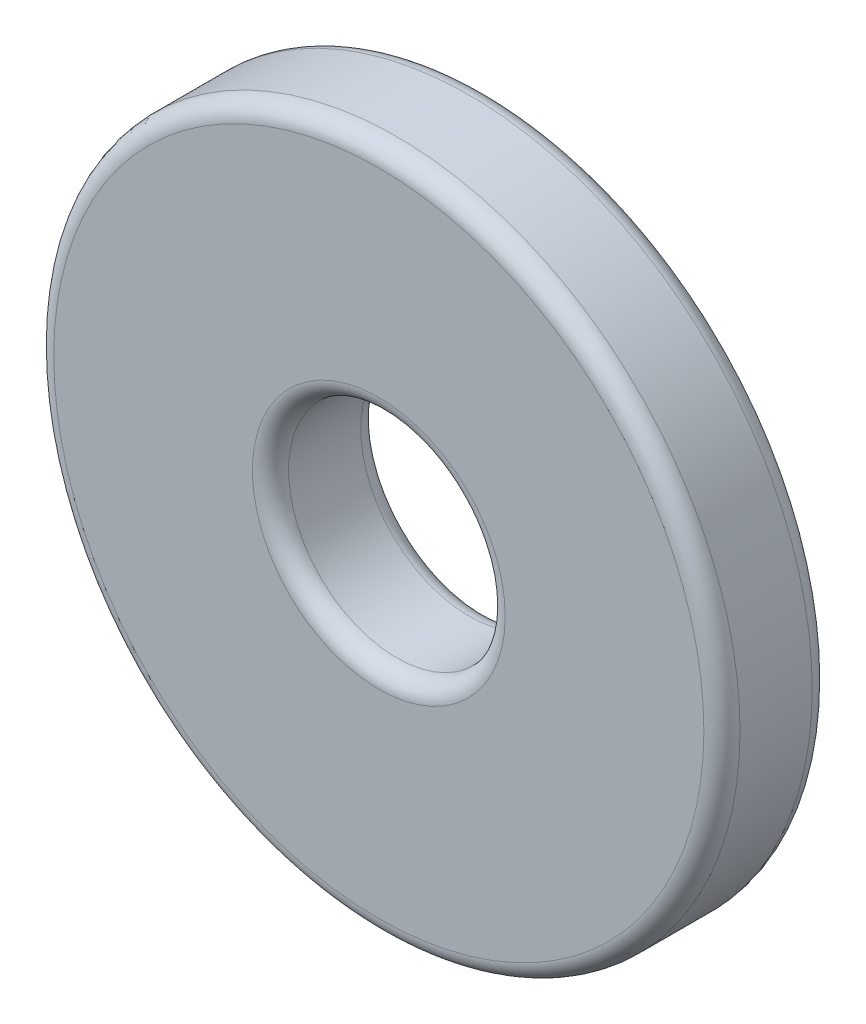
ISO-10303-21;
HEADER;
FILE_DESCRIPTION(('STEP AP214'),'2;1');
FILE_NAME('part.step','',(''),(''),'','','');
FILE_SCHEMA(('AUTOMOTIVE_DESIGN { 1 0 10303 214 1 1 1 1 }'));
ENDSEC;
DATA;
#1=APPLICATION_CONTEXT('core data for automotive mechanical design processes');
#2=APPLICATION_PROTOCOL_DEFINITION('international standard','automotive_design',2000,#1);
#3=PRODUCT_CONTEXT('',#1,'mechanical');
#4=PRODUCT('Part','Part','',(#3));
#5=PRODUCT_RELATED_PRODUCT_CATEGORY('part','',(#4));
#6=PRODUCT_DEFINITION_FORMATION('','',#4);
#7=PRODUCT_DEFINITION_CONTEXT('part definition',#1,'design');
#8=PRODUCT_DEFINITION('design','',#6,#7);
#9=PRODUCT_DEFINITION_SHAPE('','',#8);
#10=(LENGTH_UNIT() NAMED_UNIT(*) SI_UNIT(.MILLI.,.METRE.));
#11=(NAMED_UNIT(*) PLANE_ANGLE_UNIT() SI_UNIT($,.RADIAN.));
#12=(NAMED_UNIT(*) SI_UNIT($,.STERADIAN.) SOLID_ANGLE_UNIT());
#13=UNCERTAINTY_MEASURE_WITH_UNIT(LENGTH_MEASURE(1.E-05),#10,'distance_accuracy_value','');
#14=(GEOMETRIC_REPRESENTATION_CONTEXT(3) GLOBAL_UNCERTAINTY_ASSIGNED_CONTEXT((#13)) GLOBAL_UNIT_ASSIGNED_CONTEXT((#10,
#11,#12)) REPRESENTATION_CONTEXT('',''));
#15=CARTESIAN_POINT('',(0.,0.,0.));
#16=DIRECTION('',(0.,0.,1.));
#17=DIRECTION('',(1.,0.,0.));
#18=AXIS2_PLACEMENT_3D('',#15,#16,#17);
#19=CARTESIAN_POINT('',(0.,0.,-1.));
#20=DIRECTION('',(0.,0.,1.));
#21=DIRECTION('',(1.,0.,0.));
#22=AXIS2_PLACEMENT_3D('',#19,#20,#21);
#23=TOROIDAL_SURFACE('',#22,9.,0.5);
#24=CARTESIAN_POINT('',(0.,0.,-1.5));
#25=DIRECTION('',(0.,0.,1.));
#26=DIRECTION('',(1.,0.,0.));
#27=AXIS2_PLACEMENT_3D('',#24,#25,#26);
#28=CIRCLE('',#27,9.);
#29=CARTESIAN_POINT('',(9.,0.,-1.5));
#30=VERTEX_POINT('',#29);
#31=EDGE_CURVE('E54',#30,#30,#28,.F.);
#32=ORIENTED_EDGE('',*,*,#31,.F.);
#33=EDGE_LOOP('',(#32));
#34=FACE_BOUND('',#33,.T.);
#35=CARTESIAN_POINT('',(0.,0.,-1.));
#36=DIRECTION('',(0.,0.,1.));
#37=DIRECTION('',(1.,0.,0.));
#38=AXIS2_PLACEMENT_3D('',#35,#36,#37);
#39=CIRCLE('',#38,9.5);
#40=CARTESIAN_POINT('',(9.5,0.,-1.));
#41=VERTEX_POINT('',#40);
#42=EDGE_CURVE('E51',#41,#41,#39,.T.);
#43=ORIENTED_EDGE('',*,*,#42,.F.);
#44=EDGE_LOOP('',(#43));
#45=FACE_BOUND('',#44,.T.);
#46=ADVANCED_FACE('F31',(#34,#45),#23,.T.);
#47=CARTESIAN_POINT('',(0.,0.,1.));
#48=DIRECTION('',(0.,0.,1.));
#49=DIRECTION('',(1.,0.,0.));
#50=AXIS2_PLACEMENT_3D('',#47,#48,#49);
#51=TOROIDAL_SURFACE('',#50,9.,0.5);
#52=CARTESIAN_POINT('',(0.,0.,1.5));
#53=DIRECTION('',(0.,0.,1.));
#54=DIRECTION('',(1.,0.,0.));
#55=AXIS2_PLACEMENT_3D('',#52,#53,#54);
#56=CIRCLE('',#55,9.);
#57=CARTESIAN_POINT('',(9.,0.,1.5));
#58=VERTEX_POINT('',#57);
#59=EDGE_CURVE('E60',#58,#58,#56,.T.);
#60=ORIENTED_EDGE('',*,*,#59,.F.);
#61=EDGE_LOOP('',(#60));
#62=FACE_BOUND('',#61,.T.);
#63=CARTESIAN_POINT('',(0.,0.,1.));
#64=DIRECTION('',(0.,0.,1.));
#65=DIRECTION('',(1.,0.,0.));
#66=AXIS2_PLACEMENT_3D('',#63,#64,#65);
#67=CIRCLE('',#66,9.5);
#68=CARTESIAN_POINT('',(9.5,0.,1.));
#69=VERTEX_POINT('',#68);
#70=EDGE_CURVE('E57',#69,#69,#67,.F.);
#71=ORIENTED_EDGE('',*,*,#70,.F.);
#72=EDGE_LOOP('',(#71));
#73=FACE_BOUND('',#72,.T.);
#74=ADVANCED_FACE('F66',(#62,#73),#51,.T.);
#75=CARTESIAN_POINT('',(0.,0.,1.5));
#76=DIRECTION('',(0.,0.,1.));
#77=DIRECTION('',(1.,0.,0.));
#78=AXIS2_PLACEMENT_3D('',#75,#76,#77);
#79=PLANE('',#78);
#80=CARTESIAN_POINT('',(0.,0.,1.5));
#81=DIRECTION('',(0.,0.,1.));
#82=DIRECTION('',(1.,0.,0.));
#83=AXIS2_PLACEMENT_3D('',#80,#81,#82);
#84=CIRCLE('',#83,3.5);
#85=CARTESIAN_POINT('',(3.5,0.,1.5));
#86=VERTEX_POINT('',#85);
#87=EDGE_CURVE('E10',#86,#86,#84,.F.);
#88=ORIENTED_EDGE('',*,*,#87,.T.);
#89=EDGE_LOOP('',(#88));
#90=FACE_BOUND('',#89,.T.);
#91=ORIENTED_EDGE('',*,*,#59,.T.);
#92=EDGE_LOOP('',(#91));
#93=FACE_BOUND('',#92,.T.);
#94=ADVANCED_FACE('F64',(#90,#93),#79,.T.);
#95=CARTESIAN_POINT('',(0.,0.,-1.5));
#96=DIRECTION('',(0.,0.,1.));
#97=DIRECTION('',(1.,0.,0.));
#98=AXIS2_PLACEMENT_3D('',#95,#96,#97);
#99=PLANE('',#98);
#100=CARTESIAN_POINT('',(0.,0.,-1.5));
#101=DIRECTION('',(0.,0.,1.));
#102=DIRECTION('',(1.,0.,0.));
#103=AXIS2_PLACEMENT_3D('',#100,#101,#102);
#104=CIRCLE('',#103,3.5);
#105=CARTESIAN_POINT('',(3.5,0.,-1.5));
#106=VERTEX_POINT('',#105);
#107=EDGE_CURVE('E46',#106,#106,#104,.T.);
#108=ORIENTED_EDGE('',*,*,#107,.T.);
#109=EDGE_LOOP('',(#108));
#110=FACE_BOUND('',#109,.T.);
#111=ORIENTED_EDGE('',*,*,#31,.T.);
#112=EDGE_LOOP('',(#111));
#113=FACE_BOUND('',#112,.T.);
#114=ADVANCED_FACE('F75',(#110,#113),#99,.F.);
#115=CARTESIAN_POINT('',(0.,0.,1.5));
#116=DIRECTION('',(0.,0.,-1.));
#117=DIRECTION('',(-1.,0.,0.));
#118=AXIS2_PLACEMENT_3D('',#115,#116,#117);
#119=CYLINDRICAL_SURFACE('',#118,9.5);
#120=ORIENTED_EDGE('',*,*,#42,.T.);
#121=EDGE_LOOP('',(#120));
#122=FACE_BOUND('',#121,.T.);
#123=ORIENTED_EDGE('',*,*,#70,.T.);
#124=EDGE_LOOP('',(#123));
#125=FACE_BOUND('',#124,.T.);
#126=ADVANCED_FACE('F72',(#122,#125),#119,.T.);
#127=CARTESIAN_POINT('',(0.,0.,1.5));
#128=DIRECTION('',(0.,0.,-1.));
#129=DIRECTION('',(-1.,0.,0.));
#130=AXIS2_PLACEMENT_3D('',#127,#128,#129);
#131=CYLINDRICAL_SURFACE('',#130,3.);
#132=CARTESIAN_POINT('',(0.,0.,-1.));
#133=DIRECTION('',(0.,0.,1.));
#134=DIRECTION('',(1.,0.,0.));
#135=AXIS2_PLACEMENT_3D('',#132,#133,#134);
#136=CIRCLE('',#135,3.);
#137=CARTESIAN_POINT('',(3.,0.,-1.));
#138=VERTEX_POINT('',#137);
#139=EDGE_CURVE('E38',#138,#138,#136,.F.);
#140=ORIENTED_EDGE('',*,*,#139,.T.);
#141=EDGE_LOOP('',(#140));
#142=FACE_BOUND('',#141,.T.);
#143=CARTESIAN_POINT('',(0.,0.,1.));
#144=DIRECTION('',(0.,0.,1.));
#145=DIRECTION('',(1.,0.,0.));
#146=AXIS2_PLACEMENT_3D('',#143,#144,#145);
#147=CIRCLE('',#146,3.);
#148=CARTESIAN_POINT('',(3.,0.,1.));
#149=VERTEX_POINT('',#148);
#150=EDGE_CURVE('E42',#149,#149,#147,.T.);
#151=ORIENTED_EDGE('',*,*,#150,.T.);
#152=EDGE_LOOP('',(#151));
#153=FACE_BOUND('',#152,.T.);
#154=ADVANCED_FACE('F74',(#142,#153),#131,.F.);
#155=CARTESIAN_POINT('',(0.,0.,-1.));
#156=DIRECTION('',(0.,0.,1.));
#157=DIRECTION('',(1.,0.,0.));
#158=AXIS2_PLACEMENT_3D('',#155,#156,#157);
#159=TOROIDAL_SURFACE('',#158,3.5,0.5);
#160=ORIENTED_EDGE('',*,*,#139,.F.);
#161=EDGE_LOOP('',(#160));
#162=FACE_BOUND('',#161,.T.);
#163=ORIENTED_EDGE('',*,*,#107,.F.);
#164=EDGE_LOOP('',(#163));
#165=FACE_BOUND('',#164,.T.);
#166=ADVANCED_FACE('F82',(#162,#165),#159,.T.);
#167=CARTESIAN_POINT('',(0.,0.,1.));
#168=DIRECTION('',(0.,0.,1.));
#169=DIRECTION('',(1.,0.,0.));
#170=AXIS2_PLACEMENT_3D('',#167,#168,#169);
#171=TOROIDAL_SURFACE('',#170,3.5,0.5);
#172=ORIENTED_EDGE('',*,*,#87,.F.);
#173=EDGE_LOOP('',(#172));
#174=FACE_BOUND('',#173,.T.);
#175=ORIENTED_EDGE('',*,*,#150,.F.);
#176=EDGE_LOOP('',(#175));
#177=FACE_BOUND('',#176,.T.);
#178=ADVANCED_FACE('F33',(#174,#177),#171,.T.);
#179=CLOSED_SHELL('',(#46,#74,#94,#114,#126,#154,#166,#178));
#180=MANIFOLD_SOLID_BREP('B2',#179);
#181=ADVANCED_BREP_SHAPE_REPRESENTATION('',(#18,#180),#14);
#182=SHAPE_DEFINITION_REPRESENTATION(#9,#181);
ENDSEC;
END-ISO-10303-21;
